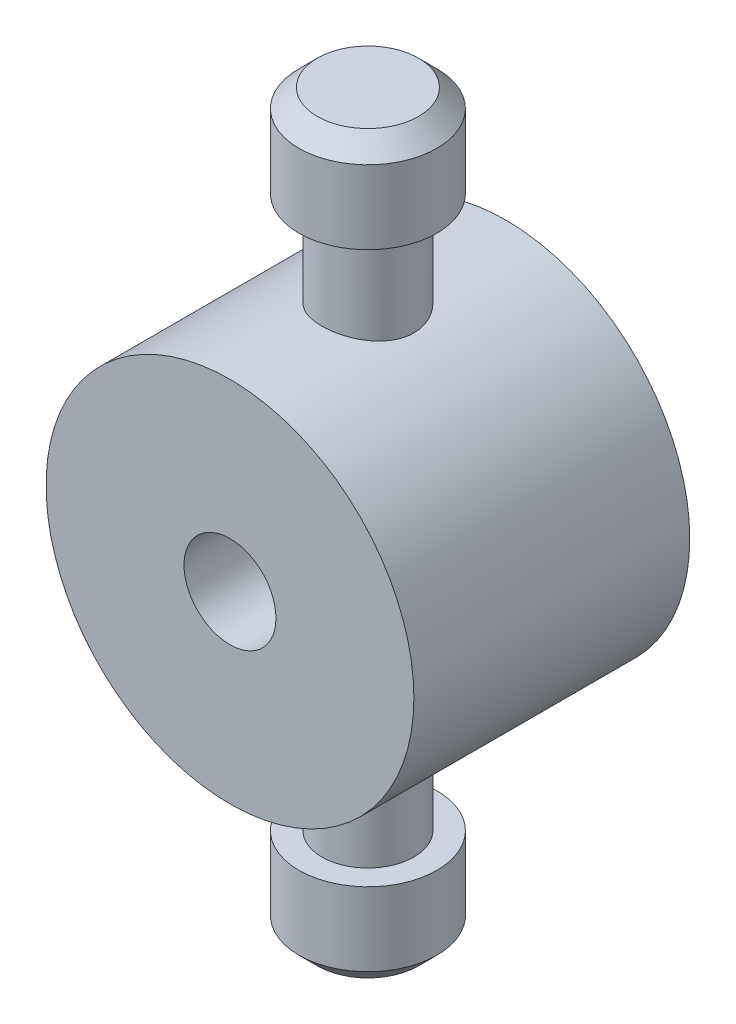
ISO-10303-21;
HEADER;
FILE_DESCRIPTION(('STEP AP214'),'2;1');
FILE_NAME('part.step','',(''),(''),'','','');
FILE_SCHEMA(('AUTOMOTIVE_DESIGN { 1 0 10303 214 1 1 1 1 }'));
ENDSEC;
DATA;
#1=APPLICATION_CONTEXT('core data for automotive mechanical design processes');
#2=APPLICATION_PROTOCOL_DEFINITION('international standard','automotive_design',2000,#1);
#3=PRODUCT_CONTEXT('',#1,'mechanical');
#4=PRODUCT('Part','Part','',(#3));
#5=PRODUCT_RELATED_PRODUCT_CATEGORY('part','',(#4));
#6=PRODUCT_DEFINITION_FORMATION('','',#4);
#7=PRODUCT_DEFINITION_CONTEXT('part definition',#1,'design');
#8=PRODUCT_DEFINITION('design','',#6,#7);
#9=PRODUCT_DEFINITION_SHAPE('','',#8);
#10=(LENGTH_UNIT() NAMED_UNIT(*) SI_UNIT(.MILLI.,.METRE.));
#11=(NAMED_UNIT(*) PLANE_ANGLE_UNIT() SI_UNIT($,.RADIAN.));
#12=(NAMED_UNIT(*) SI_UNIT($,.STERADIAN.) SOLID_ANGLE_UNIT());
#13=UNCERTAINTY_MEASURE_WITH_UNIT(LENGTH_MEASURE(1.E-05),#10,'distance_accuracy_value','');
#14=(GEOMETRIC_REPRESENTATION_CONTEXT(3) GLOBAL_UNCERTAINTY_ASSIGNED_CONTEXT((#13)) GLOBAL_UNIT_ASSIGNED_CONTEXT((#10,
#11,#12)) REPRESENTATION_CONTEXT('',''));
#15=CARTESIAN_POINT('',(0.,0.,0.));
#16=DIRECTION('',(0.,0.,1.));
#17=DIRECTION('',(1.,0.,0.));
#18=AXIS2_PLACEMENT_3D('',#15,#16,#17);
#19=CARTESIAN_POINT('',(0.,0.,30.));
#20=DIRECTION('',(0.,0.,-1.));
#21=DIRECTION('',(-1.,0.,0.));
#22=AXIS2_PLACEMENT_3D('',#19,#20,#21);
#23=CYLINDRICAL_SURFACE('',#22,20.);
#24=CARTESIAN_POINT('',(0.,-20.,20.));
#25=CARTESIAN_POINT('',(0.276253628899105,-19.9999953289337,19.9999922475395));
#26=CARTESIAN_POINT('',(0.552593859435879,-19.9942192710609,19.9770281640874));
#27=CARTESIAN_POINT('',(1.09735441256844,-19.9717371276631,19.88591616231));
#28=CARTESIAN_POINT('',(1.3657701562358,-19.9550248473325,19.8177426348738));
#29=CARTESIAN_POINT('',(1.88673624060859,-19.9125208777344,19.638535821793));
#30=CARTESIAN_POINT('',(2.13930521143334,-19.8867400947353,19.5275540042824));
#31=CARTESIAN_POINT('',(2.62224043968143,-19.8288447935874,19.2660620331839));
#32=CARTESIAN_POINT('',(2.85260594782921,-19.7967300618052,19.1155505462701));
#33=CARTESIAN_POINT('',(3.28933975766972,-19.7289137863898,18.7759973678194));
#34=CARTESIAN_POINT('',(3.49518563353686,-19.6931569049375,18.5862947501365));
#35=CARTESIAN_POINT('',(3.87249642401107,-19.6224540039312,18.1751593169699));
#36=CARTESIAN_POINT('',(4.04395745649731,-19.5875080763289,17.9537229235102));
#37=CARTESIAN_POINT('',(4.35008847599658,-19.5218258566056,17.48134924421));
#38=CARTESIAN_POINT('',(4.4841740530838,-19.4911598154937,17.2300225639709));
#39=CARTESIAN_POINT('',(4.70798969516915,-19.4383164939339,16.7075052944665));
#40=CARTESIAN_POINT('',(4.79772685146714,-19.4161378564806,16.4363178888933));
#41=CARTESIAN_POINT('',(4.92851612268255,-19.3833492232108,15.8875216726611));
#42=CARTESIAN_POINT('',(4.97050756110685,-19.372516366567,15.61015034654));
#43=CARTESIAN_POINT('',(5.00753925022136,-19.362978748653,15.0521047700022));
#44=CARTESIAN_POINT('',(5.0025871393937,-19.3642720142643,14.7714310643595));
#45=CARTESIAN_POINT('',(4.94662174879902,-19.3786401838939,14.2219473075155));
#46=CARTESIAN_POINT('',(4.89672780063545,-19.3914287669098,13.9530145951156));
#47=CARTESIAN_POINT('',(4.75408062300998,-19.426890322369,13.4274631636298));
#48=CARTESIAN_POINT('',(4.66132434023131,-19.4495639989746,13.1708453232369));
#49=CARTESIAN_POINT('',(4.43463159312395,-19.5025037968553,12.6742066124929));
#50=CARTESIAN_POINT('',(4.3002888907764,-19.5328442489939,12.4343794273681));
#51=CARTESIAN_POINT('',(3.99452092004982,-19.5976570281997,11.9802709674773));
#52=CARTESIAN_POINT('',(3.82308916269612,-19.6321300778209,11.7659941731092));
#53=CARTESIAN_POINT('',(3.44221141560407,-19.7025293513297,11.362654614352));
#54=CARTESIAN_POINT('',(3.23182086055287,-19.7384689826,11.1744850331288));
#55=CARTESIAN_POINT('',(2.78203972501233,-19.8068655192919,10.835929191787));
#56=CARTESIAN_POINT('',(2.54264825902648,-19.8393223183136,10.6855440857881));
#57=CARTESIAN_POINT('',(2.04038629560464,-19.897257736473,10.4264980459187));
#58=CARTESIAN_POINT('',(1.77743797736208,-19.9227120042576,10.3179821991519));
#59=CARTESIAN_POINT('',(1.23625336047628,-19.9635972330472,10.1469423143014));
#60=CARTESIAN_POINT('',(0.958019997168284,-19.9790301113094,10.0844094786062));
#61=CARTESIAN_POINT('',(0.40179990130009,-19.9978499757125,10.0084747814705));
#62=CARTESIAN_POINT('',(0.123989066627367,-20.0015351169426,9.99385657974899));
#63=CARTESIAN_POINT('',(-0.430109582671695,-19.9972934938151,10.0108300068516));
#64=CARTESIAN_POINT('',(-0.706397532148654,-19.9893677747284,10.0424174759971));
#65=CARTESIAN_POINT('',(-1.24538089592163,-19.9629860375783,10.1499030279713));
#66=CARTESIAN_POINT('',(-1.50821706322916,-19.9446878061929,10.2251375449232));
#67=CARTESIAN_POINT('',(-2.01752430817505,-19.8996235544719,10.4170236134282));
#68=CARTESIAN_POINT('',(-2.26399373010884,-19.8728566789995,10.5336793477107));
#69=CARTESIAN_POINT('',(-2.73841044809943,-19.8131102642072,10.8074537629156));
#70=CARTESIAN_POINT('',(-2.96595147278588,-19.7800289122193,10.9652537079886));
#71=CARTESIAN_POINT('',(-3.39175537881104,-19.7114836395924,11.3159663626572));
#72=CARTESIAN_POINT('',(-3.59001319657751,-19.676019308434,11.5088851320588));
#73=CARTESIAN_POINT('',(-3.95663522690827,-19.6056318986475,11.9300065361457));
#74=CARTESIAN_POINT('',(-4.12414622540362,-19.57074347274,12.1589590099987));
#75=CARTESIAN_POINT('',(-4.41836919671215,-19.5064292794107,12.6424421148951));
#76=CARTESIAN_POINT('',(-4.54508298053823,-19.4770032695336,12.8969716099008));
#77=CARTESIAN_POINT('',(-4.75317140202426,-19.4272698238587,13.4230190746881));
#78=CARTESIAN_POINT('',(-4.83481465547784,-19.4069085073875,13.6944254277102));
#79=CARTESIAN_POINT('',(-4.95115219981056,-19.3775581342603,14.2476987928485));
#80=CARTESIAN_POINT('',(-4.98585675825595,-19.3685665905607,14.5295635033954));
#81=CARTESIAN_POINT('',(-5.00679530111928,-19.3631633735661,15.0870700795597));
#82=CARTESIAN_POINT('',(-4.99439299259115,-19.366397756045,15.3626581171457));
#83=CARTESIAN_POINT('',(-4.92459092769654,-19.3842636317313,15.907679628939));
#84=CARTESIAN_POINT('',(-4.86719207562106,-19.3988948958968,16.1771132267195));
#85=CARTESIAN_POINT('',(-4.70977106481402,-19.4377086899187,16.7006948635334));
#86=CARTESIAN_POINT('',(-4.61000468226918,-19.461833841343,16.9549243507959));
#87=CARTESIAN_POINT('',(-4.37088304534897,-19.5169251906949,17.4432179423838));
#88=CARTESIAN_POINT('',(-4.23152230011362,-19.5478923373231,17.6772792439577));
#89=CARTESIAN_POINT('',(-3.91289249545747,-19.6141878088207,18.1251820966721));
#90=CARTESIAN_POINT('',(-3.7326772097076,-19.6496088277351,18.3383369114128));
#91=CARTESIAN_POINT('',(-3.33929790396569,-19.7202675748663,18.7318234826517));
#92=CARTESIAN_POINT('',(-3.12612607087045,-19.755505257566,18.91214743371));
#93=CARTESIAN_POINT('',(-2.66822528900865,-19.8225885215915,19.2380376952153));
#94=CARTESIAN_POINT('',(-2.42299474105462,-19.8543611121963,19.3829153789052));
#95=CARTESIAN_POINT('',(-1.91088686503491,-19.9101641658366,19.6291582098018));
#96=CARTESIAN_POINT('',(-1.64402521145579,-19.9342001733259,19.7305545354951));
#97=CARTESIAN_POINT('',(-1.14803417747824,-19.9682686521849,19.8719061010988));
#98=CARTESIAN_POINT('',(-0.921267236360228,-19.980086168423,19.9198374768448));
#99=CARTESIAN_POINT('',(-0.463020238454276,-19.9959535077316,19.9838864787398));
#100=CARTESIAN_POINT('',(-0.231540537475386,-20.0000039150298,20.0000064976843));
#101=CARTESIAN_POINT('',(0.,-20.,20.));
#102=B_SPLINE_CURVE_WITH_KNOTS('',3,(#24,#25,#26,#27,#28,#29,#30,#31,#32,#33,#34,#35,#36,#37,
#38,#39,#40,#41,#42,#43,#44,#45,#46,#47,#48,#49,#50,#51,#52,#53,#54,#55,#56,#57,#58,#59,#60,#61,
#62,#63,#64,#65,#66,#67,#68,#69,#70,#71,#72,#73,#74,#75,#76,#77,#78,#79,#80,#81,#82,#83,#84,#85,
#86,#87,#88,#89,#90,#91,#92,#93,#94,#95,#96,#97,#98,#99,#100,#101),.UNSPECIFIED.,.T.,.F.,(4,2,2,
2,2,2,2,2,2,2,2,2,2,2,2,2,2,2,2,2,2,2,2,2,2,2,2,2,2,2,2,2,2,2,2,2,2,2,4),(0.,0.827912374906299,
1.65629412587967,2.48368300762035,3.31109980056443,4.1538145145713,4.9966243193354,
5.85195491819356,6.70714870564562,7.54520983670233,8.38313460386725,9.20074990034462,
10.0184234489786,10.84435092924,11.6704230279828,12.5200500324113,13.3697029853856,
14.2222743004145,15.0746824563988,15.9052769650866,16.7357967038688,17.5540091505786,
18.372304244187,19.2051195856224,20.0380787670447,20.8914836402599,21.7448506250943,
22.5930751539527,23.4411141086095,24.2647926801851,25.0884546987996,25.9072133522467,
26.7260856048285,27.5663192139288,28.4067523259457,29.2624061835847,30.1174454609768,
30.8114080983367,31.5053185350331),.UNSPECIFIED.);
#103=CARTESIAN_POINT('',(0.,-20.,20.));
#104=VERTEX_POINT('',#103);
#105=EDGE_CURVE('E54',#104,#104,#102,.T.);
#106=ORIENTED_EDGE('',*,*,#105,.T.);
#107=EDGE_LOOP('',(#106));
#108=FACE_BOUND('',#107,.T.);
#109=CARTESIAN_POINT('',(0.,20.,20.));
#110=CARTESIAN_POINT('',(-0.276253628899102,19.9999953289337,19.9999922475395));
#111=CARTESIAN_POINT('',(-0.552593859435875,19.9942192710609,19.9770281640874));
#112=CARTESIAN_POINT('',(-1.09735441256844,19.9717371276631,19.88591616231));
#113=CARTESIAN_POINT('',(-1.3657701562358,19.9550248473325,19.8177426348738));
#114=CARTESIAN_POINT('',(-1.88673624060859,19.9125208777344,19.638535821793));
#115=CARTESIAN_POINT('',(-2.13930521143334,19.8867400947353,19.5275540042824));
#116=CARTESIAN_POINT('',(-2.62224043968143,19.8288447935874,19.2660620331839));
#117=CARTESIAN_POINT('',(-2.85260594782921,19.7967300618052,19.1155505462701));
#118=CARTESIAN_POINT('',(-3.28933975766972,19.7289137863898,18.7759973678194));
#119=CARTESIAN_POINT('',(-3.49518563353686,19.6931569049375,18.5862947501365));
#120=CARTESIAN_POINT('',(-3.87249642401106,19.6224540039312,18.1751593169699));
#121=CARTESIAN_POINT('',(-4.0439574564973,19.5875080763289,17.9537229235102));
#122=CARTESIAN_POINT('',(-4.35008847599658,19.5218258566056,17.48134924421));
#123=CARTESIAN_POINT('',(-4.4841740530838,19.4911598154937,17.2300225639709));
#124=CARTESIAN_POINT('',(-4.70798969516914,19.4383164939339,16.7075052944665));
#125=CARTESIAN_POINT('',(-4.79772685146713,19.4161378564806,16.4363178888933));
#126=CARTESIAN_POINT('',(-4.92851612268255,19.3833492232108,15.8875216726611));
#127=CARTESIAN_POINT('',(-4.97050756110684,19.372516366567,15.61015034654));
#128=CARTESIAN_POINT('',(-5.00753925022136,19.362978748653,15.0521047700022));
#129=CARTESIAN_POINT('',(-5.0025871393937,19.3642720142643,14.7714310643595));
#130=CARTESIAN_POINT('',(-4.94662174879902,19.3786401838939,14.2219473075155));
#131=CARTESIAN_POINT('',(-4.89672780063545,19.3914287669098,13.9530145951156));
#132=CARTESIAN_POINT('',(-4.75408062300998,19.426890322369,13.4274631636298));
#133=CARTESIAN_POINT('',(-4.66132434023131,19.4495639989746,13.1708453232369));
#134=CARTESIAN_POINT('',(-4.43463159312395,19.5025037968553,12.6742066124929));
#135=CARTESIAN_POINT('',(-4.3002888907764,19.5328442489939,12.4343794273681));
#136=CARTESIAN_POINT('',(-3.99452092004982,19.5976570281997,11.9802709674773));
#137=CARTESIAN_POINT('',(-3.82308916269612,19.6321300778209,11.7659941731092));
#138=CARTESIAN_POINT('',(-3.44221141560406,19.7025293513297,11.362654614352));
#139=CARTESIAN_POINT('',(-3.23182086055287,19.7384689826,11.1744850331288));
#140=CARTESIAN_POINT('',(-2.78203972501233,19.8068655192919,10.835929191787));
#141=CARTESIAN_POINT('',(-2.54264825902648,19.8393223183136,10.6855440857881));
#142=CARTESIAN_POINT('',(-2.04038629560464,19.897257736473,10.4264980459187));
#143=CARTESIAN_POINT('',(-1.77743797736208,19.9227120042576,10.3179821991519));
#144=CARTESIAN_POINT('',(-1.23625336047627,19.9635972330472,10.1469423143014));
#145=CARTESIAN_POINT('',(-0.958019997168281,19.9790301113094,10.0844094786062));
#146=CARTESIAN_POINT('',(-0.401799901300089,19.9978499757125,10.0084747814705));
#147=CARTESIAN_POINT('',(-0.123989066627366,20.0015351169426,9.99385657974899));
#148=CARTESIAN_POINT('',(0.430109582671696,19.9972934938151,10.0108300068516));
#149=CARTESIAN_POINT('',(0.706397532148656,19.9893677747284,10.0424174759971));
#150=CARTESIAN_POINT('',(1.24538089592164,19.9629860375783,10.1499030279713));
#151=CARTESIAN_POINT('',(1.50821706322917,19.9446878061929,10.2251375449232));
#152=CARTESIAN_POINT('',(2.01752430817506,19.8996235544719,10.4170236134282));
#153=CARTESIAN_POINT('',(2.26399373010884,19.8728566789995,10.5336793477107));
#154=CARTESIAN_POINT('',(2.73841044809944,19.8131102642072,10.8074537629156));
#155=CARTESIAN_POINT('',(2.96595147278589,19.7800289122193,10.9652537079886));
#156=CARTESIAN_POINT('',(3.39175537881104,19.7114836395924,11.3159663626572));
#157=CARTESIAN_POINT('',(3.59001319657751,19.676019308434,11.5088851320588));
#158=CARTESIAN_POINT('',(3.95663522690827,19.6056318986475,11.9300065361457));
#159=CARTESIAN_POINT('',(4.12414622540362,19.57074347274,12.1589590099987));
#160=CARTESIAN_POINT('',(4.41836919671215,19.5064292794107,12.6424421148951));
#161=CARTESIAN_POINT('',(4.54508298053823,19.4770032695336,12.8969716099008));
#162=CARTESIAN_POINT('',(4.75317140202426,19.4272698238587,13.4230190746881));
#163=CARTESIAN_POINT('',(4.83481465547784,19.4069085073875,13.6944254277102));
#164=CARTESIAN_POINT('',(4.95115219981057,19.3775581342603,14.2476987928484));
#165=CARTESIAN_POINT('',(4.98585675825596,19.3685665905607,14.5295635033954));
#166=CARTESIAN_POINT('',(5.00679530111928,19.3631633735661,15.0870700795597));
#167=CARTESIAN_POINT('',(4.99439299259115,19.366397756045,15.3626581171457));
#168=CARTESIAN_POINT('',(4.92459092769654,19.3842636317313,15.907679628939));
#169=CARTESIAN_POINT('',(4.86719207562106,19.3988948958968,16.1771132267195));
#170=CARTESIAN_POINT('',(4.70977106481402,19.4377086899187,16.7006948635334));
#171=CARTESIAN_POINT('',(4.61000468226918,19.461833841343,16.9549243507959));
#172=CARTESIAN_POINT('',(4.37088304534897,19.5169251906949,17.4432179423838));
#173=CARTESIAN_POINT('',(4.23152230011362,19.5478923373231,17.6772792439577));
#174=CARTESIAN_POINT('',(3.91289249545747,19.6141878088207,18.1251820966721));
#175=CARTESIAN_POINT('',(3.73267720970761,19.6496088277351,18.3383369114128));
#176=CARTESIAN_POINT('',(3.33929790396569,19.7202675748663,18.7318234826517));
#177=CARTESIAN_POINT('',(3.12612607087046,19.755505257566,18.91214743371));
#178=CARTESIAN_POINT('',(2.66822528900866,19.8225885215915,19.2380376952153));
#179=CARTESIAN_POINT('',(2.42299474105463,19.8543611121963,19.3829153789052));
#180=CARTESIAN_POINT('',(1.91088686503491,19.9101641658366,19.6291582098018));
#181=CARTESIAN_POINT('',(1.6440252114558,19.9342001733259,19.7305545354951));
#182=CARTESIAN_POINT('',(1.14803417747824,19.9682686521849,19.8719061010988));
#183=CARTESIAN_POINT('',(0.921267236360231,19.980086168423,19.9198374768448));
#184=CARTESIAN_POINT('',(0.463020238454279,19.9959535077316,19.9838864787398));
#185=CARTESIAN_POINT('',(0.231540537475389,20.0000039150298,20.0000064976843));
#186=CARTESIAN_POINT('',(0.,20.,20.));
#187=B_SPLINE_CURVE_WITH_KNOTS('',3,(#109,#110,#111,#112,#113,#114,#115,#116,#117,#118,#119,
#120,#121,#122,#123,#124,#125,#126,#127,#128,#129,#130,#131,#132,#133,#134,#135,#136,#137,#138,
#139,#140,#141,#142,#143,#144,#145,#146,#147,#148,#149,#150,#151,#152,#153,#154,#155,#156,#157,
#158,#159,#160,#161,#162,#163,#164,#165,#166,#167,#168,#169,#170,#171,#172,#173,#174,#175,#176,
#177,#178,#179,#180,#181,#182,#183,#184,#185,#186),.UNSPECIFIED.,.T.,.F.,(4,2,2,2,2,2,2,2,2,2,2,
2,2,2,2,2,2,2,2,2,2,2,2,2,2,2,2,2,2,2,2,2,2,2,2,2,2,2,4),(0.,0.827912374906299,1.65629412587967,
2.48368300762035,3.31109980056443,4.1538145145713,4.9966243193354,5.85195491819356,
6.70714870564561,7.54520983670233,8.38313460386725,9.20074990034462,10.0184234489786,
10.84435092924,11.6704230279828,12.5200500324113,13.3697029853856,14.2222743004145,
15.0746824563988,15.9052769650866,16.7357967038688,17.5540091505786,18.372304244187,
19.2051195856224,20.0380787670447,20.8914836402599,21.7448506250943,22.5930751539527,
23.4411141086095,24.2647926801851,25.0884546987996,25.9072133522467,26.7260856048285,
27.5663192139288,28.4067523259457,29.2624061835847,30.1174454609768,30.8114080983367,
31.5053185350331),.UNSPECIFIED.);
#188=CARTESIAN_POINT('',(0.,20.,20.));
#189=VERTEX_POINT('',#188);
#190=EDGE_CURVE('E63',#189,#189,#187,.T.);
#191=ORIENTED_EDGE('',*,*,#190,.T.);
#192=EDGE_LOOP('',(#191));
#193=FACE_BOUND('',#192,.T.);
#194=CARTESIAN_POINT('',(0.,0.,30.));
#195=DIRECTION('',(0.,0.,1.));
#196=DIRECTION('',(1.,0.,0.));
#197=AXIS2_PLACEMENT_3D('',#194,#195,#196);
#198=CIRCLE('',#197,20.);
#199=CARTESIAN_POINT('',(20.,0.,30.));
#200=VERTEX_POINT('',#199);
#201=EDGE_CURVE('E53',#200,#200,#198,.T.);
#202=ORIENTED_EDGE('',*,*,#201,.F.);
#203=EDGE_LOOP('',(#202));
#204=FACE_BOUND('',#203,.T.);
#205=CARTESIAN_POINT('',(0.,0.,0.));
#206=DIRECTION('',(0.,0.,1.));
#207=DIRECTION('',(1.,0.,0.));
#208=AXIS2_PLACEMENT_3D('',#205,#206,#207);
#209=CIRCLE('',#208,20.);
#210=CARTESIAN_POINT('',(20.,0.,0.));
#211=VERTEX_POINT('',#210);
#212=EDGE_CURVE('E62',#211,#211,#209,.T.);
#213=ORIENTED_EDGE('',*,*,#212,.T.);
#214=EDGE_LOOP('',(#213));
#215=FACE_BOUND('',#214,.T.);
#216=ADVANCED_FACE('F33',(#108,#193,#204,#215),#23,.T.);
#217=CARTESIAN_POINT('',(0.,0.,30.));
#218=DIRECTION('',(0.,0.,1.));
#219=DIRECTION('',(1.,0.,0.));
#220=AXIS2_PLACEMENT_3D('',#217,#218,#219);
#221=PLANE('',#220);
#222=CARTESIAN_POINT('',(0.,0.,30.));
#223=DIRECTION('',(0.,0.,1.));
#224=DIRECTION('',(1.,0.,0.));
#225=AXIS2_PLACEMENT_3D('',#222,#223,#224);
#226=CIRCLE('',#225,5.);
#227=CARTESIAN_POINT('',(5.,0.,30.));
#228=VERTEX_POINT('',#227);
#229=EDGE_CURVE('E119',#228,#228,#226,.T.);
#230=ORIENTED_EDGE('',*,*,#229,.F.);
#231=EDGE_LOOP('',(#230));
#232=FACE_BOUND('',#231,.T.);
#233=ORIENTED_EDGE('',*,*,#201,.T.);
#234=EDGE_LOOP('',(#233));
#235=FACE_BOUND('',#234,.T.);
#236=ADVANCED_FACE('F79',(#232,#235),#221,.T.);
#237=CARTESIAN_POINT('',(0.,0.,0.));
#238=DIRECTION('',(0.,0.,1.));
#239=DIRECTION('',(1.,0.,0.));
#240=AXIS2_PLACEMENT_3D('',#237,#238,#239);
#241=PLANE('',#240);
#242=ORIENTED_EDGE('',*,*,#212,.F.);
#243=EDGE_LOOP('',(#242));
#244=FACE_BOUND('',#243,.T.);
#245=ADVANCED_FACE('F82',(#244),#241,.F.);
#246=CARTESIAN_POINT('',(0.,-30.,15.));
#247=DIRECTION('',(0.,1.,0.));
#248=DIRECTION('',(0.,0.,1.));
#249=AXIS2_PLACEMENT_3D('',#246,#247,#248);
#250=CYLINDRICAL_SURFACE('',#249,5.);
#251=CARTESIAN_POINT('',(0.,30.,15.));
#252=DIRECTION('',(0.,1.,0.));
#253=DIRECTION('',(0.,0.,1.));
#254=AXIS2_PLACEMENT_3D('',#251,#252,#253);
#255=CIRCLE('',#254,5.);
#256=CARTESIAN_POINT('',(0.,30.,20.));
#257=VERTEX_POINT('',#256);
#258=EDGE_CURVE('E106',#257,#257,#255,.T.);
#259=ORIENTED_EDGE('',*,*,#258,.F.);
#260=EDGE_LOOP('',(#259));
#261=FACE_BOUND('',#260,.T.);
#262=ORIENTED_EDGE('',*,*,#190,.F.);
#263=EDGE_LOOP('',(#262));
#264=FACE_BOUND('',#263,.T.);
#265=ADVANCED_FACE('F76',(#261,#264),#250,.T.);
#266=CARTESIAN_POINT('',(0.,-30.,15.));
#267=DIRECTION('',(0.,-1.,0.));
#268=DIRECTION('',(0.,0.,-1.));
#269=AXIS2_PLACEMENT_3D('',#266,#267,#268);
#270=CIRCLE('',#269,5.);
#271=CARTESIAN_POINT('',(0.,-30.,10.));
#272=VERTEX_POINT('',#271);
#273=EDGE_CURVE('E112',#272,#272,#270,.F.);
#274=ORIENTED_EDGE('',*,*,#273,.T.);
#275=EDGE_LOOP('',(#274));
#276=FACE_BOUND('',#275,.T.);
#277=ORIENTED_EDGE('',*,*,#105,.F.);
#278=EDGE_LOOP('',(#277));
#279=FACE_BOUND('',#278,.T.);
#280=ADVANCED_FACE('F70',(#276,#279),#250,.T.);
#281=CARTESIAN_POINT('',(0.,40.,15.));
#282=DIRECTION('',(0.,-1.,0.));
#283=DIRECTION('',(0.,0.,-1.));
#284=AXIS2_PLACEMENT_3D('',#281,#282,#283);
#285=CYLINDRICAL_SURFACE('',#284,7.5);
#286=CARTESIAN_POINT('',(0.,38.,15.));
#287=DIRECTION('',(0.,1.,0.));
#288=DIRECTION('',(0.,0.,1.));
#289=AXIS2_PLACEMENT_3D('',#286,#287,#288);
#290=CIRCLE('',#289,7.5);
#291=CARTESIAN_POINT('',(0.,38.,22.5));
#292=VERTEX_POINT('',#291);
#293=EDGE_CURVE('E44',#292,#292,#290,.F.);
#294=ORIENTED_EDGE('',*,*,#293,.T.);
#295=EDGE_LOOP('',(#294));
#296=FACE_BOUND('',#295,.T.);
#297=CARTESIAN_POINT('',(0.,30.,15.));
#298=DIRECTION('',(0.,1.,0.));
#299=DIRECTION('',(0.,0.,1.));
#300=AXIS2_PLACEMENT_3D('',#297,#298,#299);
#301=CIRCLE('',#300,7.5);
#302=CARTESIAN_POINT('',(0.,30.,22.5));
#303=VERTEX_POINT('',#302);
#304=EDGE_CURVE('E109',#303,#303,#301,.T.);
#305=ORIENTED_EDGE('',*,*,#304,.T.);
#306=EDGE_LOOP('',(#305));
#307=FACE_BOUND('',#306,.T.);
#308=ADVANCED_FACE('F75',(#296,#307),#285,.T.);
#309=CARTESIAN_POINT('',(0.,40.,15.));
#310=DIRECTION('',(0.,1.,0.));
#311=DIRECTION('',(0.,0.,1.));
#312=AXIS2_PLACEMENT_3D('',#309,#310,#311);
#313=PLANE('',#312);
#314=CARTESIAN_POINT('',(0.,40.,15.));
#315=DIRECTION('',(0.,1.,0.));
#316=DIRECTION('',(0.,0.,1.));
#317=AXIS2_PLACEMENT_3D('',#314,#315,#316);
#318=CIRCLE('',#317,5.49999999999999);
#319=CARTESIAN_POINT('',(0.,40.,20.5));
#320=VERTEX_POINT('',#319);
#321=EDGE_CURVE('E48',#320,#320,#318,.T.);
#322=ORIENTED_EDGE('',*,*,#321,.T.);
#323=EDGE_LOOP('',(#322));
#324=FACE_BOUND('',#323,.T.);
#325=ADVANCED_FACE('F151',(#324),#313,.T.);
#326=CARTESIAN_POINT('',(0.,30.,15.));
#327=DIRECTION('',(0.,1.,0.));
#328=DIRECTION('',(0.,0.,1.));
#329=AXIS2_PLACEMENT_3D('',#326,#327,#328);
#330=PLANE('',#329);
#331=ORIENTED_EDGE('',*,*,#258,.T.);
#332=EDGE_LOOP('',(#331));
#333=FACE_BOUND('',#332,.T.);
#334=ORIENTED_EDGE('',*,*,#304,.F.);
#335=EDGE_LOOP('',(#334));
#336=FACE_BOUND('',#335,.T.);
#337=ADVANCED_FACE('F153',(#333,#336),#330,.F.);
#338=CARTESIAN_POINT('',(0.,40.,15.));
#339=DIRECTION('',(0.,-1.,0.));
#340=DIRECTION('',(0.,0.,-1.));
#341=AXIS2_PLACEMENT_3D('',#338,#339,#340);
#342=CONICAL_SURFACE('',#341,5.49999999999999,0.785398163397445);
#343=ORIENTED_EDGE('',*,*,#293,.F.);
#344=EDGE_LOOP('',(#343));
#345=FACE_BOUND('',#344,.T.);
#346=ORIENTED_EDGE('',*,*,#321,.F.);
#347=EDGE_LOOP('',(#346));
#348=FACE_BOUND('',#347,.T.);
#349=ADVANCED_FACE('F150',(#345,#348),#342,.T.);
#350=CARTESIAN_POINT('',(0.,-40.,15.));
#351=DIRECTION('',(0.,1.,0.));
#352=DIRECTION('',(0.,0.,1.));
#353=AXIS2_PLACEMENT_3D('',#350,#351,#352);
#354=CYLINDRICAL_SURFACE('',#353,7.5);
#355=CARTESIAN_POINT('',(0.,-38.,15.));
#356=DIRECTION('',(0.,-1.,0.));
#357=DIRECTION('',(0.,0.,-1.));
#358=AXIS2_PLACEMENT_3D('',#355,#356,#357);
#359=CIRCLE('',#358,7.5);
#360=CARTESIAN_POINT('',(0.,-38.,7.5));
#361=VERTEX_POINT('',#360);
#362=EDGE_CURVE('E40',#361,#361,#359,.F.);
#363=ORIENTED_EDGE('',*,*,#362,.T.);
#364=EDGE_LOOP('',(#363));
#365=FACE_BOUND('',#364,.T.);
#366=CARTESIAN_POINT('',(0.,-30.,15.));
#367=DIRECTION('',(0.,1.,0.));
#368=DIRECTION('',(0.,0.,1.));
#369=AXIS2_PLACEMENT_3D('',#366,#367,#368);
#370=CIRCLE('',#369,7.5);
#371=CARTESIAN_POINT('',(0.,-30.,22.5));
#372=VERTEX_POINT('',#371);
#373=EDGE_CURVE('E115',#372,#372,#370,.T.);
#374=ORIENTED_EDGE('',*,*,#373,.F.);
#375=EDGE_LOOP('',(#374));
#376=FACE_BOUND('',#375,.T.);
#377=ADVANCED_FACE('F144',(#365,#376),#354,.T.);
#378=CARTESIAN_POINT('',(0.,-40.,15.));
#379=DIRECTION('',(0.,-1.,0.));
#380=DIRECTION('',(0.,0.,1.));
#381=AXIS2_PLACEMENT_3D('',#378,#379,#380);
#382=PLANE('',#381);
#383=CARTESIAN_POINT('',(0.,-40.,15.));
#384=DIRECTION('',(0.,-1.,0.));
#385=DIRECTION('',(0.,0.,-1.));
#386=AXIS2_PLACEMENT_3D('',#383,#384,#385);
#387=CIRCLE('',#386,5.49999999999998);
#388=CARTESIAN_POINT('',(0.,-40.,9.50000000000002));
#389=VERTEX_POINT('',#388);
#390=EDGE_CURVE('E10',#389,#389,#387,.T.);
#391=ORIENTED_EDGE('',*,*,#390,.T.);
#392=EDGE_LOOP('',(#391));
#393=FACE_BOUND('',#392,.T.);
#394=ADVANCED_FACE('F141',(#393),#382,.T.);
#395=CARTESIAN_POINT('',(0.,-30.,15.));
#396=DIRECTION('',(0.,-1.,0.));
#397=DIRECTION('',(0.,0.,1.));
#398=AXIS2_PLACEMENT_3D('',#395,#396,#397);
#399=PLANE('',#398);
#400=ORIENTED_EDGE('',*,*,#273,.F.);
#401=EDGE_LOOP('',(#400));
#402=FACE_BOUND('',#401,.T.);
#403=ORIENTED_EDGE('',*,*,#373,.T.);
#404=EDGE_LOOP('',(#403));
#405=FACE_BOUND('',#404,.T.);
#406=ADVANCED_FACE('F138',(#402,#405),#399,.F.);
#407=CARTESIAN_POINT('',(0.,-38.,15.));
#408=DIRECTION('',(0.,1.,0.));
#409=DIRECTION('',(0.,0.,1.));
#410=AXIS2_PLACEMENT_3D('',#407,#408,#409);
#411=CONICAL_SURFACE('',#410,7.5,0.785398163397443);
#412=ORIENTED_EDGE('',*,*,#390,.F.);
#413=EDGE_LOOP('',(#412));
#414=FACE_BOUND('',#413,.T.);
#415=ORIENTED_EDGE('',*,*,#362,.F.);
#416=EDGE_LOOP('',(#415));
#417=FACE_BOUND('',#416,.T.);
#418=ADVANCED_FACE('F35',(#414,#417),#411,.T.);
#419=CARTESIAN_POINT('',(0.,0.,20.));
#420=DIRECTION('',(0.,0.,1.));
#421=DIRECTION('',(1.,0.,0.));
#422=AXIS2_PLACEMENT_3D('',#419,#420,#421);
#423=CYLINDRICAL_SURFACE('',#422,5.);
#424=CARTESIAN_POINT('',(0.,0.,20.));
#425=DIRECTION('',(0.,0.,1.));
#426=DIRECTION('',(1.,0.,0.));
#427=AXIS2_PLACEMENT_3D('',#424,#425,#426);
#428=CIRCLE('',#427,5.);
#429=CARTESIAN_POINT('',(5.,0.,20.));
#430=VERTEX_POINT('',#429);
#431=EDGE_CURVE('E118',#430,#430,#428,.T.);
#432=ORIENTED_EDGE('',*,*,#431,.F.);
#433=EDGE_LOOP('',(#432));
#434=FACE_BOUND('',#433,.T.);
#435=ORIENTED_EDGE('',*,*,#229,.T.);
#436=EDGE_LOOP('',(#435));
#437=FACE_BOUND('',#436,.T.);
#438=ADVANCED_FACE('F127',(#434,#437),#423,.F.);
#439=CARTESIAN_POINT('',(0.,0.,20.));
#440=DIRECTION('',(0.,0.,1.));
#441=DIRECTION('',(1.,0.,0.));
#442=AXIS2_PLACEMENT_3D('',#439,#440,#441);
#443=PLANE('',#442);
#444=ORIENTED_EDGE('',*,*,#431,.T.);
#445=EDGE_LOOP('',(#444));
#446=FACE_BOUND('',#445,.T.);
#447=ADVANCED_FACE('F125',(#446),#443,.T.);
#448=CLOSED_SHELL('',(#216,#236,#245,#265,#280,#308,#325,#337,#349,#377,#394,#406,#418,#438,#447));
#449=MANIFOLD_SOLID_BREP('B2',#448);
#450=ADVANCED_BREP_SHAPE_REPRESENTATION('',(#18,#449),#14);
#451=SHAPE_DEFINITION_REPRESENTATION(#9,#450);
ENDSEC;
END-ISO-10303-21;
